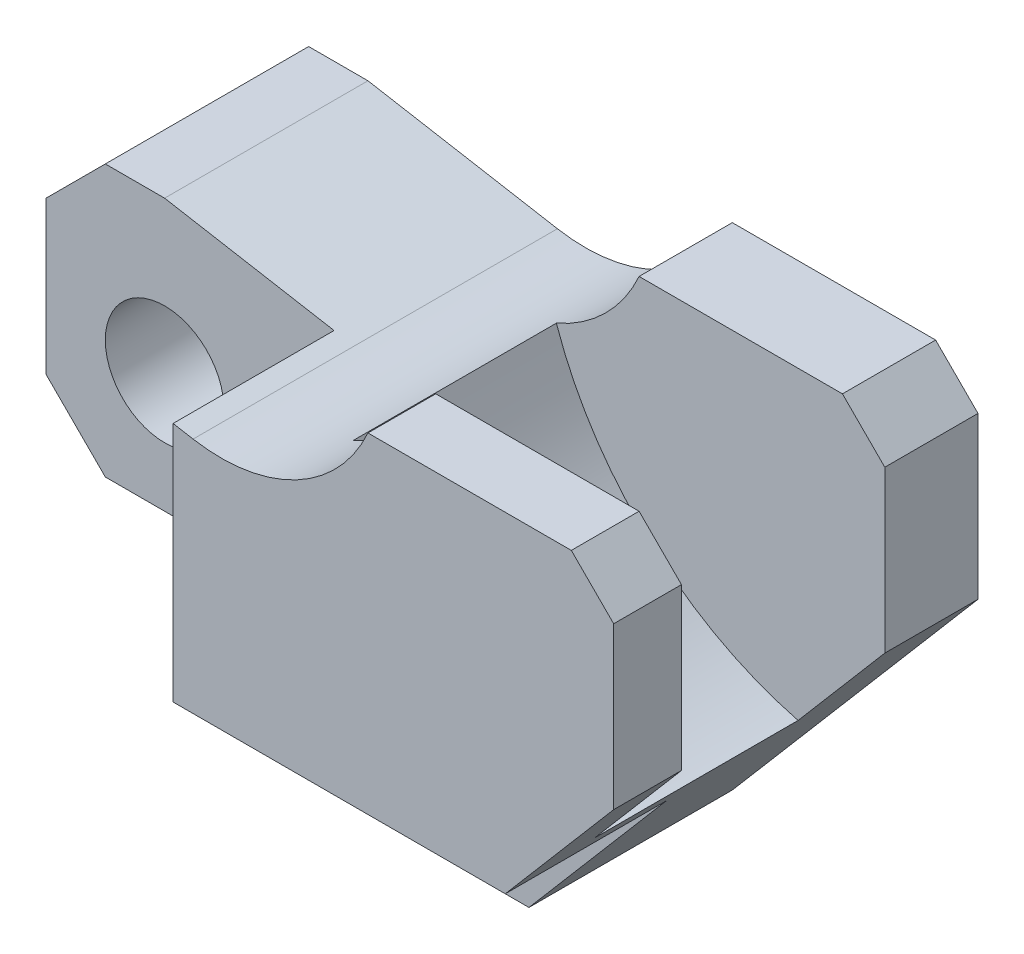
ISO-10303-21;
HEADER;
FILE_DESCRIPTION(('STEP AP214'),'2;1');
FILE_NAME('part.step','',(''),(''),'','','');
FILE_SCHEMA(('AUTOMOTIVE_DESIGN { 1 0 10303 214 1 1 1 1 }'));
ENDSEC;
DATA;
#1=APPLICATION_CONTEXT('core data for automotive mechanical design processes');
#2=APPLICATION_PROTOCOL_DEFINITION('international standard','automotive_design',2000,#1);
#3=PRODUCT_CONTEXT('',#1,'mechanical');
#4=PRODUCT('Part','Part','',(#3));
#5=PRODUCT_RELATED_PRODUCT_CATEGORY('part','',(#4));
#6=PRODUCT_DEFINITION_FORMATION('','',#4);
#7=PRODUCT_DEFINITION_CONTEXT('part definition',#1,'design');
#8=PRODUCT_DEFINITION('design','',#6,#7);
#9=PRODUCT_DEFINITION_SHAPE('','',#8);
#10=(LENGTH_UNIT() NAMED_UNIT(*) SI_UNIT(.MILLI.,.METRE.));
#11=(NAMED_UNIT(*) PLANE_ANGLE_UNIT() SI_UNIT($,.RADIAN.));
#12=(NAMED_UNIT(*) SI_UNIT($,.STERADIAN.) SOLID_ANGLE_UNIT());
#13=UNCERTAINTY_MEASURE_WITH_UNIT(LENGTH_MEASURE(1.E-05),#10,'distance_accuracy_value','');
#14=(GEOMETRIC_REPRESENTATION_CONTEXT(3) GLOBAL_UNCERTAINTY_ASSIGNED_CONTEXT((#13)) GLOBAL_UNIT_ASSIGNED_CONTEXT((#10,
#11,#12)) REPRESENTATION_CONTEXT('',''));
#15=CARTESIAN_POINT('',(0.,0.,0.));
#16=DIRECTION('',(0.,0.,1.));
#17=DIRECTION('',(1.,0.,0.));
#18=AXIS2_PLACEMENT_3D('',#15,#16,#17);
#19=CARTESIAN_POINT('',(72.,1.,43.));
#20=DIRECTION('',(-0.760833951959086,0.64894660608275,0.));
#21=DIRECTION('',(-0.64894660608275,-0.760833951959086,0.));
#22=AXIS2_PLACEMENT_3D('',#19,#20,#21);
#23=PLANE('',#22);
#24=DIRECTION('',(0.64894660608275,0.760833951959086,0.));
#25=VECTOR('',#24,1.);
#26=CARTESIAN_POINT('',(41.1847771657486,-35.1281922884326,11.));
#27=LINE('',#26,#25);
#28=CARTESIAN_POINT('',(61.7647058823529,-11.,11.));
#29=VERTEX_POINT('',#28);
#30=CARTESIAN_POINT('',(72.,1.,11.));
#31=VERTEX_POINT('',#30);
#32=EDGE_CURVE('E200',#29,#31,#27,.T.);
#33=ORIENTED_EDGE('',*,*,#32,.F.);
#34=DIRECTION('',(0.,0.,1.));
#35=VECTOR('',#34,1.);
#36=CARTESIAN_POINT('',(61.7647058823529,-11.,11.));
#37=LINE('',#36,#35);
#38=CARTESIAN_POINT('',(61.7647058823529,-11.,35.));
#39=VERTEX_POINT('',#38);
#40=EDGE_CURVE('E197',#29,#39,#37,.T.);
#41=ORIENTED_EDGE('',*,*,#40,.T.);
#42=DIRECTION('',(0.64894660608275,0.760833951959086,0.));
#43=VECTOR('',#42,1.);
#44=CARTESIAN_POINT('',(41.1847771657486,-35.1281922884326,35.));
#45=LINE('',#44,#43);
#46=CARTESIAN_POINT('',(72.,1.,35.));
#47=VERTEX_POINT('',#46);
#48=EDGE_CURVE('E404',#39,#47,#45,.T.);
#49=ORIENTED_EDGE('',*,*,#48,.T.);
#50=DIRECTION('',(0.,0.,-1.));
#51=VECTOR('',#50,1.);
#52=CARTESIAN_POINT('',(72.,1.,43.));
#53=LINE('',#52,#51);
#54=CARTESIAN_POINT('',(72.,1.,43.));
#55=VERTEX_POINT('',#54);
#56=EDGE_CURVE('E334',#55,#47,#53,.T.);
#57=ORIENTED_EDGE('',*,*,#56,.F.);
#58=DIRECTION('',(0.64894660608275,0.760833951959086,0.));
#59=VECTOR('',#58,1.);
#60=CARTESIAN_POINT('',(72.,1.,43.));
#61=LINE('',#60,#59);
#62=CARTESIAN_POINT('',(59.2058823529412,-14.,43.));
#63=VERTEX_POINT('',#62);
#64=EDGE_CURVE('E262',#63,#55,#61,.T.);
#65=ORIENTED_EDGE('',*,*,#64,.F.);
#66=DIRECTION('',(0.,0.,-1.));
#67=VECTOR('',#66,1.);
#68=CARTESIAN_POINT('',(59.2058823529412,-14.,43.));
#69=LINE('',#68,#67);
#70=CARTESIAN_POINT('',(59.2058823529412,-14.,24.));
#71=VERTEX_POINT('',#70);
#72=EDGE_CURVE('E222',#63,#71,#69,.T.);
#73=ORIENTED_EDGE('',*,*,#72,.T.);
#74=DIRECTION('',(0.64894660608275,0.760833951959086,0.));
#75=VECTOR('',#74,1.);
#76=CARTESIAN_POINT('',(72.,1.,24.));
#77=LINE('',#76,#75);
#78=CARTESIAN_POINT('',(43.,-33.,24.));
#79=VERTEX_POINT('',#78);
#80=EDGE_CURVE('E11',#79,#71,#77,.T.);
#81=ORIENTED_EDGE('',*,*,#80,.F.);
#82=DIRECTION('',(0.,0.,-1.));
#83=VECTOR('',#82,1.);
#84=CARTESIAN_POINT('',(43.,-33.,43.));
#85=LINE('',#84,#83);
#86=CARTESIAN_POINT('',(43.,-33.,0.));
#87=VERTEX_POINT('',#86);
#88=EDGE_CURVE('E337',#79,#87,#85,.T.);
#89=ORIENTED_EDGE('',*,*,#88,.T.);
#90=DIRECTION('',(0.64894660608275,0.760833951959086,0.));
#91=VECTOR('',#90,1.);
#92=CARTESIAN_POINT('',(72.,1.,0.));
#93=LINE('',#92,#91);
#94=CARTESIAN_POINT('',(72.,1.,0.));
#95=VERTEX_POINT('',#94);
#96=EDGE_CURVE('E297',#87,#95,#93,.T.);
#97=ORIENTED_EDGE('',*,*,#96,.T.);
#98=EDGE_CURVE('E333',#31,#95,#53,.T.);
#99=ORIENTED_EDGE('',*,*,#98,.F.);
#100=EDGE_LOOP('',(#33,#41,#49,#57,#65,#73,#81,#89,#97,#99));
#101=FACE_BOUND('',#100,.T.);
#102=ADVANCED_FACE('F37',(#101),#23,.F.);
#103=CARTESIAN_POINT('',(72.,20.,43.));
#104=DIRECTION('',(-1.,0.,0.));
#105=DIRECTION('',(0.,0.,1.));
#106=AXIS2_PLACEMENT_3D('',#103,#104,#105);
#107=PLANE('',#106);
#108=DIRECTION('',(0.,1.,0.));
#109=VECTOR('',#108,1.);
#110=CARTESIAN_POINT('',(72.,0.,11.));
#111=LINE('',#110,#109);
#112=CARTESIAN_POINT('',(72.,20.,11.));
#113=VERTEX_POINT('',#112);
#114=EDGE_CURVE('E425',#31,#113,#111,.T.);
#115=ORIENTED_EDGE('',*,*,#114,.F.);
#116=ORIENTED_EDGE('',*,*,#98,.T.);
#117=DIRECTION('',(0.,1.,0.));
#118=VECTOR('',#117,1.);
#119=CARTESIAN_POINT('',(72.,20.,0.));
#120=LINE('',#119,#118);
#121=CARTESIAN_POINT('',(72.,20.,0.));
#122=VERTEX_POINT('',#121);
#123=EDGE_CURVE('E300',#95,#122,#120,.T.);
#124=ORIENTED_EDGE('',*,*,#123,.T.);
#125=DIRECTION('',(0.,0.,-1.));
#126=VECTOR('',#125,1.);
#127=CARTESIAN_POINT('',(72.,20.,43.));
#128=LINE('',#127,#126);
#129=EDGE_CURVE('E329',#113,#122,#128,.T.);
#130=ORIENTED_EDGE('',*,*,#129,.F.);
#131=EDGE_LOOP('',(#115,#116,#124,#130));
#132=FACE_BOUND('',#131,.T.);
#133=ADVANCED_FACE('F432',(#132),#107,.F.);
#134=CARTESIAN_POINT('',(67.,25.,43.));
#135=DIRECTION('',(-0.707106781186546,-0.707106781186549,0.));
#136=DIRECTION('',(0.707106781186549,-0.707106781186546,0.));
#137=AXIS2_PLACEMENT_3D('',#134,#135,#136);
#138=PLANE('',#137);
#139=DIRECTION('',(-0.707106781186549,0.707106781186546,0.));
#140=VECTOR('',#139,1.);
#141=CARTESIAN_POINT('',(45.9999999999999,46.,11.));
#142=LINE('',#141,#140);
#143=CARTESIAN_POINT('',(67.,25.,11.));
#144=VERTEX_POINT('',#143);
#145=EDGE_CURVE('E217',#113,#144,#142,.T.);
#146=ORIENTED_EDGE('',*,*,#145,.F.);
#147=ORIENTED_EDGE('',*,*,#129,.T.);
#148=DIRECTION('',(-0.707106781186549,0.707106781186546,0.));
#149=VECTOR('',#148,1.);
#150=CARTESIAN_POINT('',(67.,25.,0.));
#151=LINE('',#150,#149);
#152=CARTESIAN_POINT('',(67.,25.,0.));
#153=VERTEX_POINT('',#152);
#154=EDGE_CURVE('E303',#122,#153,#151,.T.);
#155=ORIENTED_EDGE('',*,*,#154,.T.);
#156=DIRECTION('',(0.,0.,-1.));
#157=VECTOR('',#156,1.);
#158=CARTESIAN_POINT('',(67.,25.,43.));
#159=LINE('',#158,#157);
#160=EDGE_CURVE('E325',#144,#153,#159,.T.);
#161=ORIENTED_EDGE('',*,*,#160,.F.);
#162=EDGE_LOOP('',(#146,#147,#155,#161));
#163=FACE_BOUND('',#162,.T.);
#164=ADVANCED_FACE('F440',(#163),#138,.F.);
#165=CARTESIAN_POINT('',(43.,25.,43.));
#166=DIRECTION('',(0.,-1.,0.));
#167=DIRECTION('',(0.,0.,-1.));
#168=AXIS2_PLACEMENT_3D('',#165,#166,#167);
#169=PLANE('',#168);
#170=DIRECTION('',(-1.,0.,0.));
#171=VECTOR('',#170,1.);
#172=CARTESIAN_POINT('',(0.,25.,11.));
#173=LINE('',#172,#171);
#174=CARTESIAN_POINT('',(43.,25.,11.));
#175=VERTEX_POINT('',#174);
#176=EDGE_CURVE('E206',#144,#175,#173,.T.);
#177=ORIENTED_EDGE('',*,*,#176,.F.);
#178=ORIENTED_EDGE('',*,*,#160,.T.);
#179=DIRECTION('',(-1.,0.,0.));
#180=VECTOR('',#179,1.);
#181=CARTESIAN_POINT('',(43.,25.,0.));
#182=LINE('',#181,#180);
#183=CARTESIAN_POINT('',(43.,25.,0.));
#184=VERTEX_POINT('',#183);
#185=EDGE_CURVE('E306',#153,#184,#182,.T.);
#186=ORIENTED_EDGE('',*,*,#185,.T.);
#187=DIRECTION('',(0.,0.,-1.));
#188=VECTOR('',#187,1.);
#189=CARTESIAN_POINT('',(43.,25.,43.));
#190=LINE('',#189,#188);
#191=EDGE_CURVE('E322',#175,#184,#190,.T.);
#192=ORIENTED_EDGE('',*,*,#191,.F.);
#193=EDGE_LOOP('',(#177,#178,#186,#192));
#194=FACE_BOUND('',#193,.T.);
#195=ADVANCED_FACE('F442',(#194),#169,.F.);
#196=CARTESIAN_POINT('',(25.6606962114488,32.7684325399872,43.));
#197=DIRECTION('',(0.,0.,-1.));
#198=DIRECTION('',(-1.,0.,0.));
#199=AXIS2_PLACEMENT_3D('',#196,#197,#198);
#200=CYLINDRICAL_SURFACE('',#199,19.);
#201=CARTESIAN_POINT('',(25.6606962114488,32.7684325399872,11.));
#202=DIRECTION('',(0.,0.,1.));
#203=DIRECTION('',(1.,0.,0.));
#204=AXIS2_PLACEMENT_3D('',#201,#202,#203);
#205=CIRCLE('',#204,19.);
#206=CARTESIAN_POINT('',(33.2369365490243,15.344294617344,11.));
#207=VERTEX_POINT('',#206);
#208=EDGE_CURVE('E201',#175,#207,#205,.F.);
#209=ORIENTED_EDGE('',*,*,#208,.F.);
#210=ORIENTED_EDGE('',*,*,#191,.T.);
#211=CARTESIAN_POINT('',(25.6606962114488,32.7684325399872,0.));
#212=DIRECTION('',(0.,0.,-1.));
#213=DIRECTION('',(1.,0.,0.));
#214=AXIS2_PLACEMENT_3D('',#211,#212,#213);
#215=CIRCLE('',#214,19.);
#216=CARTESIAN_POINT('',(22.3613808357771,14.0570852327553,0.));
#217=VERTEX_POINT('',#216);
#218=EDGE_CURVE('E309',#184,#217,#215,.T.);
#219=ORIENTED_EDGE('',*,*,#218,.T.);
#220=DIRECTION('',(0.,0.,-1.));
#221=VECTOR('',#220,1.);
#222=CARTESIAN_POINT('',(22.3613808357771,14.0570852327553,43.));
#223=LINE('',#222,#221);
#224=CARTESIAN_POINT('',(22.3613808357771,14.0570852327553,43.));
#225=VERTEX_POINT('',#224);
#226=EDGE_CURVE('E319',#225,#217,#223,.T.);
#227=ORIENTED_EDGE('',*,*,#226,.F.);
#228=CARTESIAN_POINT('',(25.6606962114488,32.7684325399872,43.));
#229=DIRECTION('',(0.,0.,-1.));
#230=DIRECTION('',(1.,0.,0.));
#231=AXIS2_PLACEMENT_3D('',#228,#229,#230);
#232=CIRCLE('',#231,19.);
#233=CARTESIAN_POINT('',(43.,25.,43.));
#234=VERTEX_POINT('',#233);
#235=EDGE_CURVE('E271',#234,#225,#232,.T.);
#236=ORIENTED_EDGE('',*,*,#235,.F.);
#237=CARTESIAN_POINT('',(43.,25.,35.));
#238=VERTEX_POINT('',#237);
#239=EDGE_CURVE('E323',#234,#238,#190,.T.);
#240=ORIENTED_EDGE('',*,*,#239,.T.);
#241=CARTESIAN_POINT('',(25.6606962114488,32.7684325399872,35.));
#242=DIRECTION('',(0.,0.,1.));
#243=DIRECTION('',(1.,0.,0.));
#244=AXIS2_PLACEMENT_3D('',#241,#242,#243);
#245=CIRCLE('',#244,19.);
#246=CARTESIAN_POINT('',(33.2369365490243,15.344294617344,35.));
#247=VERTEX_POINT('',#246);
#248=EDGE_CURVE('E213',#238,#247,#245,.F.);
#249=ORIENTED_EDGE('',*,*,#248,.T.);
#250=DIRECTION('',(0.,0.,1.));
#251=VECTOR('',#250,1.);
#252=CARTESIAN_POINT('',(33.2369365490243,15.344294617344,11.));
#253=LINE('',#252,#251);
#254=EDGE_CURVE('E194',#207,#247,#253,.T.);
#255=ORIENTED_EDGE('',*,*,#254,.F.);
#256=EDGE_LOOP('',(#209,#210,#219,#227,#236,#240,#249,#255));
#257=FACE_BOUND('',#256,.T.);
#258=ADVANCED_FACE('F211',(#257),#200,.F.);
#259=CARTESIAN_POINT('',(25.5755389113407,-19.,43.));
#260=DIRECTION('',(0.,0.,-1.));
#261=DIRECTION('',(-1.,0.,0.));
#262=AXIS2_PLACEMENT_3D('',#259,#260,#261);
#263=CYLINDRICAL_SURFACE('',#262,5.);
#264=CARTESIAN_POINT('',(25.5755389113407,-19.,24.));
#265=DIRECTION('',(0.,0.,1.));
#266=DIRECTION('',(1.,0.,0.));
#267=AXIS2_PLACEMENT_3D('',#264,#265,#266);
#268=CIRCLE('',#267,5.);
#269=CARTESIAN_POINT('',(25.5755389113407,-14.,24.));
#270=VERTEX_POINT('',#269);
#271=CARTESIAN_POINT('',(30.5211776527525,-18.2647058823529,24.));
#272=VERTEX_POINT('',#271);
#273=EDGE_CURVE('E228',#270,#272,#268,.F.);
#274=ORIENTED_EDGE('',*,*,#273,.F.);
#275=DIRECTION('',(0.,0.,-1.));
#276=VECTOR('',#275,1.);
#277=CARTESIAN_POINT('',(25.5755389113407,-14.,43.));
#278=LINE('',#277,#276);
#279=CARTESIAN_POINT('',(25.5755389113407,-14.,0.));
#280=VERTEX_POINT('',#279);
#281=EDGE_CURVE('E343',#270,#280,#278,.T.);
#282=ORIENTED_EDGE('',*,*,#281,.T.);
#283=CARTESIAN_POINT('',(25.5755389113407,-19.,0.));
#284=DIRECTION('',(0.,0.,-1.));
#285=DIRECTION('',(-1.,0.,0.));
#286=AXIS2_PLACEMENT_3D('',#283,#284,#285);
#287=CIRCLE('',#286,5.);
#288=CARTESIAN_POINT('',(30.5211776527525,-18.2647058823529,0.));
#289=VERTEX_POINT('',#288);
#290=EDGE_CURVE('E288',#280,#289,#287,.T.);
#291=ORIENTED_EDGE('',*,*,#290,.T.);
#292=DIRECTION('',(0.,0.,-1.));
#293=VECTOR('',#292,1.);
#294=CARTESIAN_POINT('',(30.5211776527525,-18.2647058823529,43.));
#295=LINE('',#294,#293);
#296=EDGE_CURVE('E341',#272,#289,#295,.T.);
#297=ORIENTED_EDGE('',*,*,#296,.F.);
#298=EDGE_LOOP('',(#274,#282,#291,#297));
#299=FACE_BOUND('',#298,.T.);
#300=ADVANCED_FACE('F449',(#299),#263,.F.);
#301=CARTESIAN_POINT('',(59.2058823529412,-14.,43.));
#302=DIRECTION('',(0.,0.,-1.));
#303=DIRECTION('',(-1.,0.,0.));
#304=AXIS2_PLACEMENT_3D('',#301,#302,#303);
#305=CYLINDRICAL_SURFACE('',#304,29.);
#306=CARTESIAN_POINT('',(59.2058823529412,-14.,24.));
#307=DIRECTION('',(0.,0.,1.));
#308=DIRECTION('',(1.,0.,0.));
#309=AXIS2_PLACEMENT_3D('',#306,#307,#308);
#310=CIRCLE('',#309,29.);
#311=CARTESIAN_POINT('',(37.2969800527345,-33.,24.));
#312=VERTEX_POINT('',#311);
#313=EDGE_CURVE('E226',#272,#312,#310,.T.);
#314=ORIENTED_EDGE('',*,*,#313,.F.);
#315=ORIENTED_EDGE('',*,*,#296,.T.);
#316=CARTESIAN_POINT('',(59.2058823529412,-14.,0.));
#317=DIRECTION('',(0.,0.,1.));
#318=DIRECTION('',(1.,0.,0.));
#319=AXIS2_PLACEMENT_3D('',#316,#317,#318);
#320=CIRCLE('',#319,29.);
#321=CARTESIAN_POINT('',(37.2969800527345,-33.,0.));
#322=VERTEX_POINT('',#321);
#323=EDGE_CURVE('E291',#289,#322,#320,.T.);
#324=ORIENTED_EDGE('',*,*,#323,.T.);
#325=DIRECTION('',(0.,0.,-1.));
#326=VECTOR('',#325,1.);
#327=CARTESIAN_POINT('',(37.2969800527345,-33.,43.));
#328=LINE('',#327,#326);
#329=EDGE_CURVE('E339',#312,#322,#328,.T.);
#330=ORIENTED_EDGE('',*,*,#329,.F.);
#331=EDGE_LOOP('',(#314,#315,#324,#330));
#332=FACE_BOUND('',#331,.T.);
#333=ADVANCED_FACE('F464',(#332),#305,.T.);
#334=CARTESIAN_POINT('',(43.,-33.,43.));
#335=DIRECTION('',(0.,1.,0.));
#336=DIRECTION('',(0.,0.,1.));
#337=AXIS2_PLACEMENT_3D('',#334,#335,#336);
#338=PLANE('',#337);
#339=DIRECTION('',(1.,0.,0.));
#340=VECTOR('',#339,1.);
#341=CARTESIAN_POINT('',(43.,-33.,24.));
#342=LINE('',#341,#340);
#343=EDGE_CURVE('E59',#312,#79,#342,.T.);
#344=ORIENTED_EDGE('',*,*,#343,.F.);
#345=ORIENTED_EDGE('',*,*,#329,.T.);
#346=DIRECTION('',(1.,0.,0.));
#347=VECTOR('',#346,1.);
#348=CARTESIAN_POINT('',(43.,-33.,0.));
#349=LINE('',#348,#347);
#350=EDGE_CURVE('E294',#322,#87,#349,.T.);
#351=ORIENTED_EDGE('',*,*,#350,.T.);
#352=ORIENTED_EDGE('',*,*,#88,.F.);
#353=EDGE_LOOP('',(#344,#345,#351,#352));
#354=FACE_BOUND('',#353,.T.);
#355=ADVANCED_FACE('F461',(#354),#338,.F.);
#356=CARTESIAN_POINT('',(25.6606962114488,32.7684325399872,43.));
#357=DIRECTION('',(0.,0.,1.));
#358=DIRECTION('',(1.,0.,0.));
#359=AXIS2_PLACEMENT_3D('',#356,#357,#358);
#360=PLANE('',#359);
#361=DIRECTION('',(1.,0.,0.));
#362=VECTOR('',#361,1.);
#363=CARTESIAN_POINT('',(-6.99999999999997,-14.,43.));
#364=LINE('',#363,#362);
#365=CARTESIAN_POINT('',(20.,-14.,43.));
#366=VERTEX_POINT('',#365);
#367=EDGE_CURVE('E260',#366,#63,#364,.T.);
#368=ORIENTED_EDGE('',*,*,#367,.T.);
#369=ORIENTED_EDGE('',*,*,#64,.T.);
#370=DIRECTION('',(0.,1.,0.));
#371=VECTOR('',#370,1.);
#372=CARTESIAN_POINT('',(72.,20.,43.));
#373=LINE('',#372,#371);
#374=CARTESIAN_POINT('',(72.,20.,43.));
#375=VERTEX_POINT('',#374);
#376=EDGE_CURVE('E265',#55,#375,#373,.T.);
#377=ORIENTED_EDGE('',*,*,#376,.T.);
#378=DIRECTION('',(-0.707106781186549,0.707106781186546,0.));
#379=VECTOR('',#378,1.);
#380=CARTESIAN_POINT('',(67.,25.,43.));
#381=LINE('',#380,#379);
#382=CARTESIAN_POINT('',(67.,25.,43.));
#383=VERTEX_POINT('',#382);
#384=EDGE_CURVE('E267',#375,#383,#381,.T.);
#385=ORIENTED_EDGE('',*,*,#384,.T.);
#386=DIRECTION('',(-1.,0.,0.));
#387=VECTOR('',#386,1.);
#388=CARTESIAN_POINT('',(43.,25.,43.));
#389=LINE('',#388,#387);
#390=EDGE_CURVE('E269',#383,#234,#389,.T.);
#391=ORIENTED_EDGE('',*,*,#390,.T.);
#392=ORIENTED_EDGE('',*,*,#235,.T.);
#393=DIRECTION('',(-0.984807753012208,0.173648177666931,0.));
#394=VECTOR('',#393,1.);
#395=CARTESIAN_POINT('',(0.,18.,43.));
#396=LINE('',#395,#394);
#397=CARTESIAN_POINT('',(20.,14.4734603858307,43.));
#398=VERTEX_POINT('',#397);
#399=EDGE_CURVE('E273',#225,#398,#396,.T.);
#400=ORIENTED_EDGE('',*,*,#399,.T.);
#401=DIRECTION('',(0.,1.,0.));
#402=VECTOR('',#401,1.);
#403=CARTESIAN_POINT('',(20.,-35.,43.));
#404=LINE('',#403,#402);
#405=EDGE_CURVE('E230',#366,#398,#404,.T.);
#406=ORIENTED_EDGE('',*,*,#405,.F.);
#407=EDGE_LOOP('',(#368,#369,#377,#385,#391,#392,#400,#406));
#408=FACE_BOUND('',#407,.T.);
#409=ADVANCED_FACE('F361',(#408),#360,.T.);
#410=CARTESIAN_POINT('',(25.6606962114488,32.7684325399872,0.));
#411=DIRECTION('',(0.,0.,1.));
#412=DIRECTION('',(1.,0.,0.));
#413=AXIS2_PLACEMENT_3D('',#410,#411,#412);
#414=PLANE('',#413);
#415=DIRECTION('',(-0.707106781186546,-0.707106781186549,0.));
#416=VECTOR('',#415,1.);
#417=CARTESIAN_POINT('',(-14.,11.,0.));
#418=LINE('',#417,#416);
#419=CARTESIAN_POINT('',(-7.00000000000003,18.,0.));
#420=VERTEX_POINT('',#419);
#421=CARTESIAN_POINT('',(-14.,11.,0.));
#422=VERTEX_POINT('',#421);
#423=EDGE_CURVE('E259',#420,#422,#418,.T.);
#424=ORIENTED_EDGE('',*,*,#423,.F.);
#425=DIRECTION('',(-1.,0.,0.));
#426=VECTOR('',#425,1.);
#427=CARTESIAN_POINT('',(-7.00000000000003,18.,0.));
#428=LINE('',#427,#426);
#429=CARTESIAN_POINT('',(0.,18.,0.));
#430=VERTEX_POINT('',#429);
#431=EDGE_CURVE('E263',#430,#420,#428,.T.);
#432=ORIENTED_EDGE('',*,*,#431,.F.);
#433=DIRECTION('',(-0.984807753012208,0.173648177666931,0.));
#434=VECTOR('',#433,1.);
#435=CARTESIAN_POINT('',(0.,18.,0.));
#436=LINE('',#435,#434);
#437=EDGE_CURVE('E311',#217,#430,#436,.T.);
#438=ORIENTED_EDGE('',*,*,#437,.F.);
#439=ORIENTED_EDGE('',*,*,#218,.F.);
#440=ORIENTED_EDGE('',*,*,#185,.F.);
#441=ORIENTED_EDGE('',*,*,#154,.F.);
#442=ORIENTED_EDGE('',*,*,#123,.F.);
#443=ORIENTED_EDGE('',*,*,#96,.F.);
#444=ORIENTED_EDGE('',*,*,#350,.F.);
#445=ORIENTED_EDGE('',*,*,#323,.F.);
#446=ORIENTED_EDGE('',*,*,#290,.F.);
#447=DIRECTION('',(1.,0.,0.));
#448=VECTOR('',#447,1.);
#449=CARTESIAN_POINT('',(-6.99999999999997,-14.,0.));
#450=LINE('',#449,#448);
#451=CARTESIAN_POINT('',(-6.99999999999997,-14.,0.));
#452=VERTEX_POINT('',#451);
#453=EDGE_CURVE('E285',#452,#280,#450,.T.);
#454=ORIENTED_EDGE('',*,*,#453,.F.);
#455=DIRECTION('',(0.707106781186549,-0.707106781186546,0.));
#456=VECTOR('',#455,1.);
#457=CARTESIAN_POINT('',(-14.,-7.,0.));
#458=LINE('',#457,#456);
#459=CARTESIAN_POINT('',(-14.,-7.,0.));
#460=VERTEX_POINT('',#459);
#461=EDGE_CURVE('E282',#460,#452,#458,.T.);
#462=ORIENTED_EDGE('',*,*,#461,.F.);
#463=DIRECTION('',(0.,-1.,0.));
#464=VECTOR('',#463,1.);
#465=CARTESIAN_POINT('',(-14.,11.,0.));
#466=LINE('',#465,#464);
#467=EDGE_CURVE('E279',#422,#460,#466,.T.);
#468=ORIENTED_EDGE('',*,*,#467,.F.);
#469=EDGE_LOOP('',(#424,#432,#438,#439,#440,#441,#442,#443,#444,#445,#446,#454,#462,#468));
#470=FACE_BOUND('',#469,.T.);
#471=CARTESIAN_POINT('',(0.,0.,0.));
#472=DIRECTION('',(0.,0.,1.));
#473=DIRECTION('',(1.,0.,0.));
#474=AXIS2_PLACEMENT_3D('',#471,#472,#473);
#475=CIRCLE('',#474,7.);
#476=CARTESIAN_POINT('',(7.,0.,0.));
#477=VERTEX_POINT('',#476);
#478=EDGE_CURVE('E256',#477,#477,#475,.T.);
#479=ORIENTED_EDGE('',*,*,#478,.T.);
#480=EDGE_LOOP('',(#479));
#481=FACE_BOUND('',#480,.T.);
#482=ADVANCED_FACE('F372',(#470,#481),#414,.F.);
#483=CARTESIAN_POINT('',(-14.,11.,43.));
#484=DIRECTION('',(0.707106781186549,-0.707106781186546,0.));
#485=DIRECTION('',(0.707106781186546,0.707106781186549,0.));
#486=AXIS2_PLACEMENT_3D('',#483,#484,#485);
#487=PLANE('',#486);
#488=DIRECTION('',(0.,0.,-1.));
#489=VECTOR('',#488,1.);
#490=CARTESIAN_POINT('',(-14.,11.,43.));
#491=LINE('',#490,#489);
#492=CARTESIAN_POINT('',(-14.,11.,24.));
#493=VERTEX_POINT('',#492);
#494=EDGE_CURVE('E349',#493,#422,#491,.T.);
#495=ORIENTED_EDGE('',*,*,#494,.F.);
#496=DIRECTION('',(0.707106781186546,0.707106781186549,0.));
#497=VECTOR('',#496,1.);
#498=CARTESIAN_POINT('',(-14.,11.,24.));
#499=LINE('',#498,#497);
#500=CARTESIAN_POINT('',(-7.00000000000003,18.,24.));
#501=VERTEX_POINT('',#500);
#502=EDGE_CURVE('E245',#493,#501,#499,.T.);
#503=ORIENTED_EDGE('',*,*,#502,.T.);
#504=DIRECTION('',(0.,0.,-1.));
#505=VECTOR('',#504,1.);
#506=CARTESIAN_POINT('',(-7.00000000000003,18.,43.));
#507=LINE('',#506,#505);
#508=EDGE_CURVE('E276',#501,#420,#507,.T.);
#509=ORIENTED_EDGE('',*,*,#508,.T.);
#510=ORIENTED_EDGE('',*,*,#423,.T.);
#511=EDGE_LOOP('',(#495,#503,#509,#510));
#512=FACE_BOUND('',#511,.T.);
#513=ADVANCED_FACE('F39',(#512),#487,.F.);
#514=CARTESIAN_POINT('',(-14.,11.,43.));
#515=DIRECTION('',(1.,0.,0.));
#516=DIRECTION('',(0.,1.,0.));
#517=AXIS2_PLACEMENT_3D('',#514,#515,#516);
#518=PLANE('',#517);
#519=DIRECTION('',(0.,0.,-1.));
#520=VECTOR('',#519,1.);
#521=CARTESIAN_POINT('',(-14.,-7.,43.));
#522=LINE('',#521,#520);
#523=CARTESIAN_POINT('',(-14.,-7.,24.));
#524=VERTEX_POINT('',#523);
#525=EDGE_CURVE('E347',#524,#460,#522,.T.);
#526=ORIENTED_EDGE('',*,*,#525,.F.);
#527=DIRECTION('',(0.,1.,0.));
#528=VECTOR('',#527,1.);
#529=CARTESIAN_POINT('',(-14.,-35.,24.));
#530=LINE('',#529,#528);
#531=EDGE_CURVE('E231',#524,#493,#530,.T.);
#532=ORIENTED_EDGE('',*,*,#531,.T.);
#533=ORIENTED_EDGE('',*,*,#494,.T.);
#534=ORIENTED_EDGE('',*,*,#467,.T.);
#535=EDGE_LOOP('',(#526,#532,#533,#534));
#536=FACE_BOUND('',#535,.T.);
#537=ADVANCED_FACE('F385',(#536),#518,.F.);
#538=CARTESIAN_POINT('',(-14.,-7.,43.));
#539=DIRECTION('',(0.707106781186546,0.707106781186549,0.));
#540=DIRECTION('',(-0.707106781186549,0.707106781186546,0.));
#541=AXIS2_PLACEMENT_3D('',#538,#539,#540);
#542=PLANE('',#541);
#543=DIRECTION('',(0.,0.,-1.));
#544=VECTOR('',#543,1.);
#545=CARTESIAN_POINT('',(-6.99999999999997,-14.,43.));
#546=LINE('',#545,#544);
#547=CARTESIAN_POINT('',(-6.99999999999997,-14.,24.));
#548=VERTEX_POINT('',#547);
#549=EDGE_CURVE('E345',#548,#452,#546,.T.);
#550=ORIENTED_EDGE('',*,*,#549,.F.);
#551=DIRECTION('',(-0.707106781186549,0.707106781186546,0.));
#552=VECTOR('',#551,1.);
#553=CARTESIAN_POINT('',(-14.,-7.,24.));
#554=LINE('',#553,#552);
#555=EDGE_CURVE('E250',#548,#524,#554,.T.);
#556=ORIENTED_EDGE('',*,*,#555,.T.);
#557=ORIENTED_EDGE('',*,*,#525,.T.);
#558=ORIENTED_EDGE('',*,*,#461,.T.);
#559=EDGE_LOOP('',(#550,#556,#557,#558));
#560=FACE_BOUND('',#559,.T.);
#561=ADVANCED_FACE('F391',(#560),#542,.F.);
#562=CARTESIAN_POINT('',(-6.99999999999997,-14.,43.));
#563=DIRECTION('',(0.,1.,0.));
#564=DIRECTION('',(-1.,0.,0.));
#565=AXIS2_PLACEMENT_3D('',#562,#563,#564);
#566=PLANE('',#565);
#567=DIRECTION('',(0.,0.,-1.));
#568=VECTOR('',#567,1.);
#569=CARTESIAN_POINT('',(20.,-14.,43.));
#570=LINE('',#569,#568);
#571=CARTESIAN_POINT('',(20.,-14.,24.));
#572=VERTEX_POINT('',#571);
#573=EDGE_CURVE('E253',#366,#572,#570,.T.);
#574=ORIENTED_EDGE('',*,*,#573,.T.);
#575=DIRECTION('',(-1.,0.,0.));
#576=VECTOR('',#575,1.);
#577=CARTESIAN_POINT('',(-6.99999999999997,-14.,24.));
#578=LINE('',#577,#576);
#579=EDGE_CURVE('E248',#572,#548,#578,.T.);
#580=ORIENTED_EDGE('',*,*,#579,.T.);
#581=ORIENTED_EDGE('',*,*,#549,.T.);
#582=ORIENTED_EDGE('',*,*,#453,.T.);
#583=ORIENTED_EDGE('',*,*,#281,.F.);
#584=DIRECTION('',(-1.,0.,0.));
#585=VECTOR('',#584,1.);
#586=CARTESIAN_POINT('',(16.0991606157116,-14.,24.));
#587=LINE('',#586,#585);
#588=EDGE_CURVE('E215',#71,#270,#587,.T.);
#589=ORIENTED_EDGE('',*,*,#588,.F.);
#590=ORIENTED_EDGE('',*,*,#72,.F.);
#591=ORIENTED_EDGE('',*,*,#367,.F.);
#592=EDGE_LOOP('',(#574,#580,#581,#582,#583,#589,#590,#591));
#593=FACE_BOUND('',#592,.T.);
#594=ADVANCED_FACE('F395',(#593),#566,.F.);
#595=ORIENTED_EDGE('',*,*,#56,.T.);
#596=DIRECTION('',(0.,1.,0.));
#597=VECTOR('',#596,1.);
#598=CARTESIAN_POINT('',(72.,0.,35.));
#599=LINE('',#598,#597);
#600=CARTESIAN_POINT('',(72.,20.,35.));
#601=VERTEX_POINT('',#600);
#602=EDGE_CURVE('E409',#47,#601,#599,.T.);
#603=ORIENTED_EDGE('',*,*,#602,.T.);
#604=EDGE_CURVE('E330',#375,#601,#128,.T.);
#605=ORIENTED_EDGE('',*,*,#604,.F.);
#606=ORIENTED_EDGE('',*,*,#376,.F.);
#607=EDGE_LOOP('',(#595,#603,#605,#606));
#608=FACE_BOUND('',#607,.T.);
#609=ADVANCED_FACE('F407',(#608),#107,.F.);
#610=ORIENTED_EDGE('',*,*,#604,.T.);
#611=DIRECTION('',(-0.707106781186549,0.707106781186546,0.));
#612=VECTOR('',#611,1.);
#613=CARTESIAN_POINT('',(45.9999999999999,46.,35.));
#614=LINE('',#613,#612);
#615=CARTESIAN_POINT('',(67.,25.,35.));
#616=VERTEX_POINT('',#615);
#617=EDGE_CURVE('E414',#601,#616,#614,.T.);
#618=ORIENTED_EDGE('',*,*,#617,.T.);
#619=EDGE_CURVE('E326',#383,#616,#159,.T.);
#620=ORIENTED_EDGE('',*,*,#619,.F.);
#621=ORIENTED_EDGE('',*,*,#384,.F.);
#622=EDGE_LOOP('',(#610,#618,#620,#621));
#623=FACE_BOUND('',#622,.T.);
#624=ADVANCED_FACE('F413',(#623),#138,.F.);
#625=ORIENTED_EDGE('',*,*,#619,.T.);
#626=DIRECTION('',(-1.,0.,0.));
#627=VECTOR('',#626,1.);
#628=CARTESIAN_POINT('',(0.,25.,35.));
#629=LINE('',#628,#627);
#630=EDGE_CURVE('E209',#616,#238,#629,.T.);
#631=ORIENTED_EDGE('',*,*,#630,.T.);
#632=ORIENTED_EDGE('',*,*,#239,.F.);
#633=ORIENTED_EDGE('',*,*,#390,.F.);
#634=EDGE_LOOP('',(#625,#631,#632,#633));
#635=FACE_BOUND('',#634,.T.);
#636=ADVANCED_FACE('F417',(#635),#169,.F.);
#637=CARTESIAN_POINT('',(0.,18.,43.));
#638=DIRECTION('',(-0.173648177666931,-0.984807753012208,0.));
#639=DIRECTION('',(0.984807753012208,-0.173648177666931,0.));
#640=AXIS2_PLACEMENT_3D('',#637,#638,#639);
#641=PLANE('',#640);
#642=DIRECTION('',(0.,0.,-1.));
#643=VECTOR('',#642,1.);
#644=CARTESIAN_POINT('',(0.,18.,43.));
#645=LINE('',#644,#643);
#646=CARTESIAN_POINT('',(0.,18.,24.));
#647=VERTEX_POINT('',#646);
#648=EDGE_CURVE('E317',#647,#430,#645,.T.);
#649=ORIENTED_EDGE('',*,*,#648,.F.);
#650=DIRECTION('',(0.984807753012208,-0.173648177666931,0.));
#651=VECTOR('',#650,1.);
#652=CARTESIAN_POINT('',(0.,18.,24.));
#653=LINE('',#652,#651);
#654=CARTESIAN_POINT('',(20.,14.4734603858307,24.));
#655=VERTEX_POINT('',#654);
#656=EDGE_CURVE('E242',#647,#655,#653,.T.);
#657=ORIENTED_EDGE('',*,*,#656,.T.);
#658=DIRECTION('',(0.,0.,1.));
#659=VECTOR('',#658,1.);
#660=CARTESIAN_POINT('',(20.,14.4734603858307,43.));
#661=LINE('',#660,#659);
#662=EDGE_CURVE('E45',#655,#398,#661,.T.);
#663=ORIENTED_EDGE('',*,*,#662,.T.);
#664=ORIENTED_EDGE('',*,*,#399,.F.);
#665=ORIENTED_EDGE('',*,*,#226,.T.);
#666=ORIENTED_EDGE('',*,*,#437,.T.);
#667=EDGE_LOOP('',(#649,#657,#663,#664,#665,#666));
#668=FACE_BOUND('',#667,.T.);
#669=ADVANCED_FACE('F356',(#668),#641,.F.);
#670=CARTESIAN_POINT('',(-7.00000000000003,18.,43.));
#671=DIRECTION('',(0.,-1.,0.));
#672=DIRECTION('',(1.,0.,0.));
#673=AXIS2_PLACEMENT_3D('',#670,#671,#672);
#674=PLANE('',#673);
#675=ORIENTED_EDGE('',*,*,#508,.F.);
#676=DIRECTION('',(1.,0.,0.));
#677=VECTOR('',#676,1.);
#678=CARTESIAN_POINT('',(-7.00000000000003,18.,24.));
#679=LINE('',#678,#677);
#680=EDGE_CURVE('E239',#501,#647,#679,.T.);
#681=ORIENTED_EDGE('',*,*,#680,.T.);
#682=ORIENTED_EDGE('',*,*,#648,.T.);
#683=ORIENTED_EDGE('',*,*,#431,.T.);
#684=EDGE_LOOP('',(#675,#681,#682,#683));
#685=FACE_BOUND('',#684,.T.);
#686=ADVANCED_FACE('F378',(#685),#674,.F.);
#687=CARTESIAN_POINT('',(0.,0.,43.));
#688=DIRECTION('',(0.,0.,-1.));
#689=DIRECTION('',(-1.,0.,0.));
#690=AXIS2_PLACEMENT_3D('',#687,#688,#689);
#691=CYLINDRICAL_SURFACE('',#690,7.);
#692=CARTESIAN_POINT('',(0.,0.,24.));
#693=DIRECTION('',(0.,0.,-1.));
#694=DIRECTION('',(-1.,0.,0.));
#695=AXIS2_PLACEMENT_3D('',#692,#693,#694);
#696=CIRCLE('',#695,7.);
#697=CARTESIAN_POINT('',(-7.,0.,24.));
#698=VERTEX_POINT('',#697);
#699=EDGE_CURVE('E234',#698,#698,#696,.T.);
#700=ORIENTED_EDGE('',*,*,#699,.F.);
#701=EDGE_LOOP('',(#700));
#702=FACE_BOUND('',#701,.T.);
#703=ORIENTED_EDGE('',*,*,#478,.F.);
#704=EDGE_LOOP('',(#703));
#705=FACE_BOUND('',#704,.T.);
#706=ADVANCED_FACE('F492',(#702,#705),#691,.F.);
#707=CARTESIAN_POINT('',(20.,-35.,24.));
#708=DIRECTION('',(1.,0.,0.));
#709=DIRECTION('',(0.,0.,-1.));
#710=AXIS2_PLACEMENT_3D('',#707,#708,#709);
#711=PLANE('',#710);
#712=ORIENTED_EDGE('',*,*,#405,.T.);
#713=ORIENTED_EDGE('',*,*,#662,.F.);
#714=DIRECTION('',(0.,1.,0.));
#715=VECTOR('',#714,1.);
#716=CARTESIAN_POINT('',(20.,-35.,24.));
#717=LINE('',#716,#715);
#718=EDGE_CURVE('E235',#572,#655,#717,.T.);
#719=ORIENTED_EDGE('',*,*,#718,.F.);
#720=ORIENTED_EDGE('',*,*,#573,.F.);
#721=EDGE_LOOP('',(#712,#713,#719,#720));
#722=FACE_BOUND('',#721,.T.);
#723=ADVANCED_FACE('F394',(#722),#711,.F.);
#724=CARTESIAN_POINT('',(-14.,-35.,24.));
#725=DIRECTION('',(0.,0.,-1.));
#726=DIRECTION('',(-1.,0.,0.));
#727=AXIS2_PLACEMENT_3D('',#724,#725,#726);
#728=PLANE('',#727);
#729=ORIENTED_EDGE('',*,*,#699,.T.);
#730=EDGE_LOOP('',(#729));
#731=FACE_BOUND('',#730,.T.);
#732=ORIENTED_EDGE('',*,*,#579,.F.);
#733=ORIENTED_EDGE('',*,*,#718,.T.);
#734=ORIENTED_EDGE('',*,*,#656,.F.);
#735=ORIENTED_EDGE('',*,*,#680,.F.);
#736=ORIENTED_EDGE('',*,*,#502,.F.);
#737=ORIENTED_EDGE('',*,*,#531,.F.);
#738=ORIENTED_EDGE('',*,*,#555,.F.);
#739=EDGE_LOOP('',(#732,#733,#734,#735,#736,#737,#738));
#740=FACE_BOUND('',#739,.T.);
#741=ADVANCED_FACE('F380',(#731,#740),#728,.F.);
#742=CARTESIAN_POINT('',(0.,0.,24.));
#743=DIRECTION('',(0.,0.,1.));
#744=DIRECTION('',(1.,0.,0.));
#745=AXIS2_PLACEMENT_3D('',#742,#743,#744);
#746=PLANE('',#745);
#747=ORIENTED_EDGE('',*,*,#273,.T.);
#748=ORIENTED_EDGE('',*,*,#313,.T.);
#749=ORIENTED_EDGE('',*,*,#343,.T.);
#750=ORIENTED_EDGE('',*,*,#80,.T.);
#751=ORIENTED_EDGE('',*,*,#588,.T.);
#752=EDGE_LOOP('',(#747,#748,#749,#750,#751));
#753=FACE_BOUND('',#752,.T.);
#754=ADVANCED_FACE('F524',(#753),#746,.T.);
#755=CARTESIAN_POINT('',(72.,28.7018734359634,11.));
#756=DIRECTION('',(0.,0.,1.));
#757=DIRECTION('',(1.,0.,0.));
#758=AXIS2_PLACEMENT_3D('',#755,#756,#757);
#759=CYLINDRICAL_SURFACE('',#758,41.);
#760=CARTESIAN_POINT('',(72.,28.7018734359634,35.));
#761=DIRECTION('',(0.,0.,1.));
#762=DIRECTION('',(1.,0.,0.));
#763=AXIS2_PLACEMENT_3D('',#760,#761,#762);
#764=CIRCLE('',#763,41.);
#765=EDGE_CURVE('E52',#247,#39,#764,.T.);
#766=ORIENTED_EDGE('',*,*,#765,.T.);
#767=ORIENTED_EDGE('',*,*,#40,.F.);
#768=CARTESIAN_POINT('',(72.,28.7018734359634,11.));
#769=DIRECTION('',(0.,0.,1.));
#770=DIRECTION('',(1.,0.,0.));
#771=AXIS2_PLACEMENT_3D('',#768,#769,#770);
#772=CIRCLE('',#771,41.);
#773=EDGE_CURVE('E190',#207,#29,#772,.T.);
#774=ORIENTED_EDGE('',*,*,#773,.F.);
#775=ORIENTED_EDGE('',*,*,#254,.T.);
#776=EDGE_LOOP('',(#766,#767,#774,#775));
#777=FACE_BOUND('',#776,.T.);
#778=ADVANCED_FACE('F192',(#777),#759,.F.);
#779=CARTESIAN_POINT('',(0.,0.,11.));
#780=DIRECTION('',(0.,0.,1.));
#781=DIRECTION('',(1.,0.,0.));
#782=AXIS2_PLACEMENT_3D('',#779,#780,#781);
#783=PLANE('',#782);
#784=ORIENTED_EDGE('',*,*,#208,.T.);
#785=ORIENTED_EDGE('',*,*,#773,.T.);
#786=ORIENTED_EDGE('',*,*,#32,.T.);
#787=ORIENTED_EDGE('',*,*,#114,.T.);
#788=ORIENTED_EDGE('',*,*,#145,.T.);
#789=ORIENTED_EDGE('',*,*,#176,.T.);
#790=EDGE_LOOP('',(#784,#785,#786,#787,#788,#789));
#791=FACE_BOUND('',#790,.T.);
#792=ADVANCED_FACE('F204',(#791),#783,.T.);
#793=CARTESIAN_POINT('',(0.,0.,35.));
#794=DIRECTION('',(0.,0.,1.));
#795=DIRECTION('',(1.,0.,0.));
#796=AXIS2_PLACEMENT_3D('',#793,#794,#795);
#797=PLANE('',#796);
#798=ORIENTED_EDGE('',*,*,#248,.F.);
#799=ORIENTED_EDGE('',*,*,#630,.F.);
#800=ORIENTED_EDGE('',*,*,#617,.F.);
#801=ORIENTED_EDGE('',*,*,#602,.F.);
#802=ORIENTED_EDGE('',*,*,#48,.F.);
#803=ORIENTED_EDGE('',*,*,#765,.F.);
#804=EDGE_LOOP('',(#798,#799,#800,#801,#802,#803));
#805=FACE_BOUND('',#804,.T.);
#806=ADVANCED_FACE('F588',(#805),#797,.F.);
#807=CLOSED_SHELL('',(#102,#133,#164,#195,#258,#300,#333,#355,#409,#482,#513,#537,#561,#594,
#609,#624,#636,#669,#686,#706,#723,#741,#754,#778,#792,#806));
#808=MANIFOLD_SOLID_BREP('B2',#807);
#809=ADVANCED_BREP_SHAPE_REPRESENTATION('',(#18,#808),#14);
#810=SHAPE_DEFINITION_REPRESENTATION(#9,#809);
ENDSEC;
END-ISO-10303-21;
